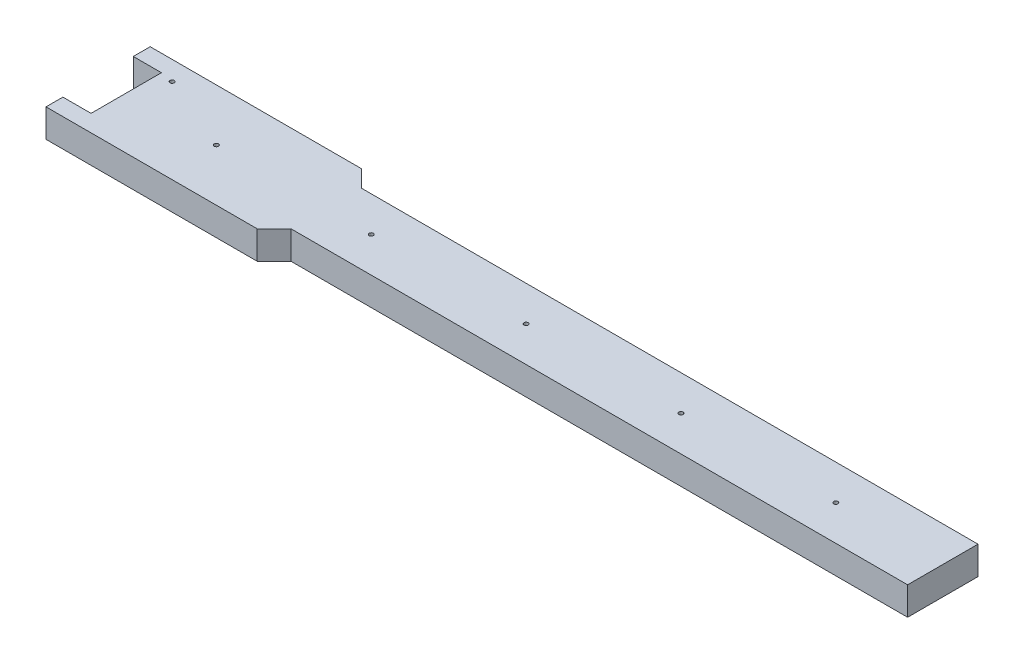
ISO-10303-21;
HEADER;
FILE_DESCRIPTION(('STEP AP214'),'2;1');
FILE_NAME('part.step','',(''),(''),'','','');
FILE_SCHEMA(('AUTOMOTIVE_DESIGN { 1 0 10303 214 1 1 1 1 }'));
ENDSEC;
DATA;
#1=APPLICATION_CONTEXT('core data for automotive mechanical design processes');
#2=APPLICATION_PROTOCOL_DEFINITION('international standard','automotive_design',2000,#1);
#3=PRODUCT_CONTEXT('',#1,'mechanical');
#4=PRODUCT('Part','Part','',(#3));
#5=PRODUCT_RELATED_PRODUCT_CATEGORY('part','',(#4));
#6=PRODUCT_DEFINITION_FORMATION('','',#4);
#7=PRODUCT_DEFINITION_CONTEXT('part definition',#1,'design');
#8=PRODUCT_DEFINITION('design','',#6,#7);
#9=PRODUCT_DEFINITION_SHAPE('','',#8);
#10=(LENGTH_UNIT() NAMED_UNIT(*) SI_UNIT(.MILLI.,.METRE.));
#11=(NAMED_UNIT(*) PLANE_ANGLE_UNIT() SI_UNIT($,.RADIAN.));
#12=(NAMED_UNIT(*) SI_UNIT($,.STERADIAN.) SOLID_ANGLE_UNIT());
#13=UNCERTAINTY_MEASURE_WITH_UNIT(LENGTH_MEASURE(1.E-05),#10,'distance_accuracy_value','');
#14=(GEOMETRIC_REPRESENTATION_CONTEXT(3) GLOBAL_UNCERTAINTY_ASSIGNED_CONTEXT((#13)) GLOBAL_UNIT_ASSIGNED_CONTEXT((#10,
#11,#12)) REPRESENTATION_CONTEXT('',''));
#15=CARTESIAN_POINT('',(0.,0.,0.));
#16=DIRECTION('',(0.,0.,1.));
#17=DIRECTION('',(1.,0.,0.));
#18=AXIS2_PLACEMENT_3D('',#15,#16,#17);
#19=CARTESIAN_POINT('',(0.,10.,-25.));
#20=DIRECTION('',(1.,0.,0.));
#21=DIRECTION('',(0.,0.,-1.));
#22=AXIS2_PLACEMENT_3D('',#19,#20,#21);
#23=PLANE('',#22);
#24=DIRECTION('',(0.,0.,1.));
#25=VECTOR('',#24,1.);
#26=CARTESIAN_POINT('',(0.,0.,-25.));
#27=LINE('',#26,#25);
#28=CARTESIAN_POINT('',(-1.11022302462516E-13,0.,-31.));
#29=VERTEX_POINT('',#28);
#30=CARTESIAN_POINT('',(0.,0.,-25.));
#31=VERTEX_POINT('',#30);
#32=EDGE_CURVE('E158',#29,#31,#27,.T.);
#33=ORIENTED_EDGE('',*,*,#32,.T.);
#34=DIRECTION('',(0.,-1.,0.));
#35=VECTOR('',#34,1.);
#36=CARTESIAN_POINT('',(0.,10.,-25.));
#37=LINE('',#36,#35);
#38=CARTESIAN_POINT('',(0.,10.,-25.));
#39=VERTEX_POINT('',#38);
#40=EDGE_CURVE('E206',#39,#31,#37,.T.);
#41=ORIENTED_EDGE('',*,*,#40,.F.);
#42=DIRECTION('',(0.,0.,1.));
#43=VECTOR('',#42,1.);
#44=CARTESIAN_POINT('',(0.,10.,-25.));
#45=LINE('',#44,#43);
#46=CARTESIAN_POINT('',(-1.11022302462516E-13,10.,-31.));
#47=VERTEX_POINT('',#46);
#48=EDGE_CURVE('E181',#47,#39,#45,.T.);
#49=ORIENTED_EDGE('',*,*,#48,.F.);
#50=DIRECTION('',(0.,-1.,0.));
#51=VECTOR('',#50,1.);
#52=CARTESIAN_POINT('',(-1.11022302462516E-13,10.,-31.));
#53=LINE('',#52,#51);
#54=EDGE_CURVE('E154',#47,#29,#53,.T.);
#55=ORIENTED_EDGE('',*,*,#54,.T.);
#56=EDGE_LOOP('',(#33,#41,#49,#55));
#57=FACE_BOUND('',#56,.T.);
#58=ADVANCED_FACE('F35',(#57),#23,.F.);
#59=CARTESIAN_POINT('',(9.99999999999998,10.,-25.));
#60=DIRECTION('',(0.,0.,-1.));
#61=DIRECTION('',(-1.,0.,0.));
#62=AXIS2_PLACEMENT_3D('',#59,#60,#61);
#63=PLANE('',#62);
#64=DIRECTION('',(1.,0.,0.));
#65=VECTOR('',#64,1.);
#66=CARTESIAN_POINT('',(9.99999999999998,0.,-25.));
#67=LINE('',#66,#65);
#68=CARTESIAN_POINT('',(9.99999999999998,0.,-25.));
#69=VERTEX_POINT('',#68);
#70=EDGE_CURVE('E161',#31,#69,#67,.T.);
#71=ORIENTED_EDGE('',*,*,#70,.T.);
#72=DIRECTION('',(0.,-1.,0.));
#73=VECTOR('',#72,1.);
#74=CARTESIAN_POINT('',(9.99999999999998,10.,-25.));
#75=LINE('',#74,#73);
#76=CARTESIAN_POINT('',(9.99999999999998,10.,-25.));
#77=VERTEX_POINT('',#76);
#78=EDGE_CURVE('E203',#77,#69,#75,.T.);
#79=ORIENTED_EDGE('',*,*,#78,.F.);
#80=DIRECTION('',(1.,0.,0.));
#81=VECTOR('',#80,1.);
#82=CARTESIAN_POINT('',(9.99999999999998,10.,-25.));
#83=LINE('',#82,#81);
#84=EDGE_CURVE('E108',#39,#77,#83,.T.);
#85=ORIENTED_EDGE('',*,*,#84,.F.);
#86=ORIENTED_EDGE('',*,*,#40,.T.);
#87=EDGE_LOOP('',(#71,#79,#85,#86));
#88=FACE_BOUND('',#87,.T.);
#89=ADVANCED_FACE('F247',(#88),#63,.F.);
#90=CARTESIAN_POINT('',(9.99999999999999,10.,0.));
#91=DIRECTION('',(1.,0.,0.));
#92=DIRECTION('',(0.,0.,-1.));
#93=AXIS2_PLACEMENT_3D('',#90,#91,#92);
#94=PLANE('',#93);
#95=DIRECTION('',(0.,0.,1.));
#96=VECTOR('',#95,1.);
#97=CARTESIAN_POINT('',(9.99999999999999,0.,0.));
#98=LINE('',#97,#96);
#99=CARTESIAN_POINT('',(9.99999999999999,0.,0.));
#100=VERTEX_POINT('',#99);
#101=EDGE_CURVE('E164',#69,#100,#98,.T.);
#102=ORIENTED_EDGE('',*,*,#101,.T.);
#103=DIRECTION('',(0.,-1.,0.));
#104=VECTOR('',#103,1.);
#105=CARTESIAN_POINT('',(9.99999999999999,10.,0.));
#106=LINE('',#105,#104);
#107=CARTESIAN_POINT('',(9.99999999999999,10.,0.));
#108=VERTEX_POINT('',#107);
#109=EDGE_CURVE('E200',#108,#100,#106,.T.);
#110=ORIENTED_EDGE('',*,*,#109,.F.);
#111=DIRECTION('',(0.,0.,1.));
#112=VECTOR('',#111,1.);
#113=CARTESIAN_POINT('',(9.99999999999999,10.,0.));
#114=LINE('',#113,#112);
#115=EDGE_CURVE('E339',#77,#108,#114,.T.);
#116=ORIENTED_EDGE('',*,*,#115,.F.);
#117=ORIENTED_EDGE('',*,*,#78,.T.);
#118=EDGE_LOOP('',(#102,#110,#116,#117));
#119=FACE_BOUND('',#118,.T.);
#120=ADVANCED_FACE('F253',(#119),#94,.F.);
#121=CARTESIAN_POINT('',(0.,10.,0.));
#122=DIRECTION('',(0.,0.,1.));
#123=DIRECTION('',(1.,0.,0.));
#124=AXIS2_PLACEMENT_3D('',#121,#122,#123);
#125=PLANE('',#124);
#126=DIRECTION('',(-1.,0.,0.));
#127=VECTOR('',#126,1.);
#128=CARTESIAN_POINT('',(0.,0.,0.));
#129=LINE('',#128,#127);
#130=CARTESIAN_POINT('',(0.,0.,0.));
#131=VERTEX_POINT('',#130);
#132=EDGE_CURVE('E166',#100,#131,#129,.T.);
#133=ORIENTED_EDGE('',*,*,#132,.T.);
#134=DIRECTION('',(0.,-1.,0.));
#135=VECTOR('',#134,1.);
#136=CARTESIAN_POINT('',(0.,10.,0.));
#137=LINE('',#136,#135);
#138=CARTESIAN_POINT('',(0.,10.,0.));
#139=VERTEX_POINT('',#138);
#140=EDGE_CURVE('E197',#139,#131,#137,.T.);
#141=ORIENTED_EDGE('',*,*,#140,.F.);
#142=DIRECTION('',(-1.,0.,0.));
#143=VECTOR('',#142,1.);
#144=CARTESIAN_POINT('',(0.,10.,0.));
#145=LINE('',#144,#143);
#146=EDGE_CURVE('E341',#108,#139,#145,.T.);
#147=ORIENTED_EDGE('',*,*,#146,.F.);
#148=ORIENTED_EDGE('',*,*,#109,.T.);
#149=EDGE_LOOP('',(#133,#141,#147,#148));
#150=FACE_BOUND('',#149,.T.);
#151=ADVANCED_FACE('F373',(#150),#125,.F.);
#152=CARTESIAN_POINT('',(0.,10.,6.00000000000009));
#153=DIRECTION('',(1.,0.,0.));
#154=DIRECTION('',(0.,0.,-1.));
#155=AXIS2_PLACEMENT_3D('',#152,#153,#154);
#156=PLANE('',#155);
#157=DIRECTION('',(0.,0.,1.));
#158=VECTOR('',#157,1.);
#159=CARTESIAN_POINT('',(0.,0.,6.00000000000009));
#160=LINE('',#159,#158);
#161=CARTESIAN_POINT('',(0.,0.,6.00000000000009));
#162=VERTEX_POINT('',#161);
#163=EDGE_CURVE('E168',#131,#162,#160,.T.);
#164=ORIENTED_EDGE('',*,*,#163,.T.);
#165=DIRECTION('',(0.,-1.,0.));
#166=VECTOR('',#165,1.);
#167=CARTESIAN_POINT('',(0.,10.,6.00000000000009));
#168=LINE('',#167,#166);
#169=CARTESIAN_POINT('',(0.,10.,6.00000000000009));
#170=VERTEX_POINT('',#169);
#171=EDGE_CURVE('E194',#170,#162,#168,.T.);
#172=ORIENTED_EDGE('',*,*,#171,.F.);
#173=DIRECTION('',(0.,0.,1.));
#174=VECTOR('',#173,1.);
#175=CARTESIAN_POINT('',(0.,10.,6.00000000000009));
#176=LINE('',#175,#174);
#177=EDGE_CURVE('E343',#139,#170,#176,.T.);
#178=ORIENTED_EDGE('',*,*,#177,.F.);
#179=ORIENTED_EDGE('',*,*,#140,.T.);
#180=EDGE_LOOP('',(#164,#172,#178,#179));
#181=FACE_BOUND('',#180,.T.);
#182=ADVANCED_FACE('F379',(#181),#156,.F.);
#183=CARTESIAN_POINT('',(75.,10.,6.00000000000002));
#184=DIRECTION('',(0.,0.,-1.));
#185=DIRECTION('',(-1.,0.,0.));
#186=AXIS2_PLACEMENT_3D('',#183,#184,#185);
#187=PLANE('',#186);
#188=DIRECTION('',(1.,0.,0.));
#189=VECTOR('',#188,1.);
#190=CARTESIAN_POINT('',(75.,0.,6.00000000000002));
#191=LINE('',#190,#189);
#192=CARTESIAN_POINT('',(75.,0.,6.00000000000002));
#193=VERTEX_POINT('',#192);
#194=EDGE_CURVE('E170',#162,#193,#191,.T.);
#195=ORIENTED_EDGE('',*,*,#194,.T.);
#196=DIRECTION('',(0.,-1.,0.));
#197=VECTOR('',#196,1.);
#198=CARTESIAN_POINT('',(75.,10.,6.00000000000002));
#199=LINE('',#198,#197);
#200=CARTESIAN_POINT('',(75.,10.,6.00000000000002));
#201=VERTEX_POINT('',#200);
#202=EDGE_CURVE('E191',#201,#193,#199,.T.);
#203=ORIENTED_EDGE('',*,*,#202,.F.);
#204=DIRECTION('',(1.,0.,0.));
#205=VECTOR('',#204,1.);
#206=CARTESIAN_POINT('',(75.,10.,6.00000000000002));
#207=LINE('',#206,#205);
#208=EDGE_CURVE('E345',#170,#201,#207,.T.);
#209=ORIENTED_EDGE('',*,*,#208,.F.);
#210=ORIENTED_EDGE('',*,*,#171,.T.);
#211=EDGE_LOOP('',(#195,#203,#209,#210));
#212=FACE_BOUND('',#211,.T.);
#213=ADVANCED_FACE('F383',(#212),#187,.F.);
#214=CARTESIAN_POINT('',(80.9999999999998,10.,0.));
#215=DIRECTION('',(-0.707106781186556,0.,-0.70710678118654));
#216=DIRECTION('',(-0.70710678118654,0.,0.707106781186556));
#217=AXIS2_PLACEMENT_3D('',#214,#215,#216);
#218=PLANE('',#217);
#219=DIRECTION('',(0.70710678118654,0.,-0.707106781186556));
#220=VECTOR('',#219,1.);
#221=CARTESIAN_POINT('',(80.9999999999998,0.,0.));
#222=LINE('',#221,#220);
#223=CARTESIAN_POINT('',(80.9999999999998,0.,0.));
#224=VERTEX_POINT('',#223);
#225=EDGE_CURVE('E172',#193,#224,#222,.T.);
#226=ORIENTED_EDGE('',*,*,#225,.T.);
#227=DIRECTION('',(0.,-1.,0.));
#228=VECTOR('',#227,1.);
#229=CARTESIAN_POINT('',(80.9999999999998,10.,0.));
#230=LINE('',#229,#228);
#231=CARTESIAN_POINT('',(80.9999999999998,10.,0.));
#232=VERTEX_POINT('',#231);
#233=EDGE_CURVE('E188',#232,#224,#230,.T.);
#234=ORIENTED_EDGE('',*,*,#233,.F.);
#235=DIRECTION('',(0.70710678118654,0.,-0.707106781186556));
#236=VECTOR('',#235,1.);
#237=CARTESIAN_POINT('',(80.9999999999998,10.,0.));
#238=LINE('',#237,#236);
#239=EDGE_CURVE('E347',#201,#232,#238,.T.);
#240=ORIENTED_EDGE('',*,*,#239,.F.);
#241=ORIENTED_EDGE('',*,*,#202,.T.);
#242=EDGE_LOOP('',(#226,#234,#240,#241));
#243=FACE_BOUND('',#242,.T.);
#244=ADVANCED_FACE('F386',(#243),#218,.F.);
#245=CARTESIAN_POINT('',(300.,10.,0.));
#246=DIRECTION('',(0.,0.,-1.));
#247=DIRECTION('',(-1.,0.,0.));
#248=AXIS2_PLACEMENT_3D('',#245,#246,#247);
#249=PLANE('',#248);
#250=DIRECTION('',(1.,0.,0.));
#251=VECTOR('',#250,1.);
#252=CARTESIAN_POINT('',(300.,0.,0.));
#253=LINE('',#252,#251);
#254=CARTESIAN_POINT('',(300.,0.,0.));
#255=VERTEX_POINT('',#254);
#256=EDGE_CURVE('E174',#224,#255,#253,.T.);
#257=ORIENTED_EDGE('',*,*,#256,.T.);
#258=DIRECTION('',(0.,-1.,0.));
#259=VECTOR('',#258,1.);
#260=CARTESIAN_POINT('',(300.,10.,0.));
#261=LINE('',#260,#259);
#262=CARTESIAN_POINT('',(300.,10.,0.));
#263=VERTEX_POINT('',#262);
#264=EDGE_CURVE('E185',#263,#255,#261,.T.);
#265=ORIENTED_EDGE('',*,*,#264,.F.);
#266=DIRECTION('',(1.,0.,0.));
#267=VECTOR('',#266,1.);
#268=CARTESIAN_POINT('',(300.,10.,0.));
#269=LINE('',#268,#267);
#270=EDGE_CURVE('E349',#232,#263,#269,.T.);
#271=ORIENTED_EDGE('',*,*,#270,.F.);
#272=ORIENTED_EDGE('',*,*,#233,.T.);
#273=EDGE_LOOP('',(#257,#265,#271,#272));
#274=FACE_BOUND('',#273,.T.);
#275=ADVANCED_FACE('F355',(#274),#249,.F.);
#276=CARTESIAN_POINT('',(300.,10.,-25.0000000000001));
#277=DIRECTION('',(-1.,0.,0.));
#278=DIRECTION('',(0.,0.,1.));
#279=AXIS2_PLACEMENT_3D('',#276,#277,#278);
#280=PLANE('',#279);
#281=DIRECTION('',(0.,0.,-1.));
#282=VECTOR('',#281,1.);
#283=CARTESIAN_POINT('',(300.,0.,-25.0000000000001));
#284=LINE('',#283,#282);
#285=CARTESIAN_POINT('',(300.,0.,-25.0000000000001));
#286=VERTEX_POINT('',#285);
#287=EDGE_CURVE('E176',#255,#286,#284,.T.);
#288=ORIENTED_EDGE('',*,*,#287,.T.);
#289=DIRECTION('',(0.,-1.,0.));
#290=VECTOR('',#289,1.);
#291=CARTESIAN_POINT('',(300.,10.,-25.0000000000001));
#292=LINE('',#291,#290);
#293=CARTESIAN_POINT('',(300.,10.,-25.0000000000001));
#294=VERTEX_POINT('',#293);
#295=EDGE_CURVE('E149',#294,#286,#292,.T.);
#296=ORIENTED_EDGE('',*,*,#295,.F.);
#297=DIRECTION('',(0.,0.,-1.));
#298=VECTOR('',#297,1.);
#299=CARTESIAN_POINT('',(300.,10.,-25.0000000000001));
#300=LINE('',#299,#298);
#301=EDGE_CURVE('E140',#263,#294,#300,.T.);
#302=ORIENTED_EDGE('',*,*,#301,.F.);
#303=ORIENTED_EDGE('',*,*,#264,.T.);
#304=EDGE_LOOP('',(#288,#296,#302,#303));
#305=FACE_BOUND('',#304,.T.);
#306=ADVANCED_FACE('F359',(#305),#280,.F.);
#307=CARTESIAN_POINT('',(80.9999999999999,10.,-25.0000000000001));
#308=DIRECTION('',(0.,0.,1.));
#309=DIRECTION('',(1.,0.,0.));
#310=AXIS2_PLACEMENT_3D('',#307,#308,#309);
#311=PLANE('',#310);
#312=DIRECTION('',(-1.,0.,0.));
#313=VECTOR('',#312,1.);
#314=CARTESIAN_POINT('',(80.9999999999999,0.,-25.0000000000001));
#315=LINE('',#314,#313);
#316=CARTESIAN_POINT('',(80.9999999999999,0.,-25.0000000000001));
#317=VERTEX_POINT('',#316);
#318=EDGE_CURVE('E148',#286,#317,#315,.T.);
#319=ORIENTED_EDGE('',*,*,#318,.T.);
#320=DIRECTION('',(0.,-1.,0.));
#321=VECTOR('',#320,1.);
#322=CARTESIAN_POINT('',(80.9999999999999,10.,-25.0000000000001));
#323=LINE('',#322,#321);
#324=CARTESIAN_POINT('',(80.9999999999999,10.,-25.0000000000001));
#325=VERTEX_POINT('',#324);
#326=EDGE_CURVE('E145',#325,#317,#323,.T.);
#327=ORIENTED_EDGE('',*,*,#326,.F.);
#328=DIRECTION('',(-1.,0.,0.));
#329=VECTOR('',#328,1.);
#330=CARTESIAN_POINT('',(80.9999999999999,10.,-25.0000000000001));
#331=LINE('',#330,#329);
#332=EDGE_CURVE('E133',#294,#325,#331,.T.);
#333=ORIENTED_EDGE('',*,*,#332,.F.);
#334=ORIENTED_EDGE('',*,*,#295,.T.);
#335=EDGE_LOOP('',(#319,#327,#333,#334));
#336=FACE_BOUND('',#335,.T.);
#337=ADVANCED_FACE('F146',(#336),#311,.F.);
#338=CARTESIAN_POINT('',(74.9999999999999,10.,-30.9999999999999));
#339=DIRECTION('',(-0.707106781186541,0.,0.707106781186554));
#340=DIRECTION('',(0.707106781186554,0.,0.707106781186541));
#341=AXIS2_PLACEMENT_3D('',#338,#339,#340);
#342=PLANE('',#341);
#343=DIRECTION('',(-0.707106781186554,0.,-0.707106781186541));
#344=VECTOR('',#343,1.);
#345=CARTESIAN_POINT('',(74.9999999999999,0.,-30.9999999999999));
#346=LINE('',#345,#344);
#347=CARTESIAN_POINT('',(74.9999999999999,0.,-30.9999999999999));
#348=VERTEX_POINT('',#347);
#349=EDGE_CURVE('E93',#317,#348,#346,.T.);
#350=ORIENTED_EDGE('',*,*,#349,.T.);
#351=DIRECTION('',(0.,-1.,0.));
#352=VECTOR('',#351,1.);
#353=CARTESIAN_POINT('',(74.9999999999999,10.,-30.9999999999999));
#354=LINE('',#353,#352);
#355=CARTESIAN_POINT('',(74.9999999999999,10.,-30.9999999999999));
#356=VERTEX_POINT('',#355);
#357=EDGE_CURVE('E150',#356,#348,#354,.T.);
#358=ORIENTED_EDGE('',*,*,#357,.F.);
#359=DIRECTION('',(-0.707106781186554,0.,-0.707106781186541));
#360=VECTOR('',#359,1.);
#361=CARTESIAN_POINT('',(74.9999999999999,10.,-30.9999999999999));
#362=LINE('',#361,#360);
#363=EDGE_CURVE('E138',#325,#356,#362,.T.);
#364=ORIENTED_EDGE('',*,*,#363,.F.);
#365=ORIENTED_EDGE('',*,*,#326,.T.);
#366=EDGE_LOOP('',(#350,#358,#364,#365));
#367=FACE_BOUND('',#366,.T.);
#368=ADVANCED_FACE('F152',(#367),#342,.F.);
#369=CARTESIAN_POINT('',(-1.11022302462516E-13,10.,-31.));
#370=DIRECTION('',(0.,0.,1.));
#371=DIRECTION('',(1.,0.,0.));
#372=AXIS2_PLACEMENT_3D('',#369,#370,#371);
#373=PLANE('',#372);
#374=DIRECTION('',(-1.,0.,0.));
#375=VECTOR('',#374,1.);
#376=CARTESIAN_POINT('',(-1.11022302462516E-13,0.,-31.));
#377=LINE('',#376,#375);
#378=EDGE_CURVE('E99',#348,#29,#377,.T.);
#379=ORIENTED_EDGE('',*,*,#378,.T.);
#380=ORIENTED_EDGE('',*,*,#54,.F.);
#381=DIRECTION('',(-1.,0.,0.));
#382=VECTOR('',#381,1.);
#383=CARTESIAN_POINT('',(-1.11022302462516E-13,10.,-31.));
#384=LINE('',#383,#382);
#385=EDGE_CURVE('E52',#356,#47,#384,.T.);
#386=ORIENTED_EDGE('',*,*,#385,.F.);
#387=ORIENTED_EDGE('',*,*,#357,.T.);
#388=EDGE_LOOP('',(#379,#380,#386,#387));
#389=FACE_BOUND('',#388,.T.);
#390=ADVANCED_FACE('F231',(#389),#373,.F.);
#391=CARTESIAN_POINT('',(0.,10.,0.));
#392=DIRECTION('',(0.,-1.,0.));
#393=DIRECTION('',(0.,0.,-1.));
#394=AXIS2_PLACEMENT_3D('',#391,#392,#393);
#395=PLANE('',#394);
#396=CARTESIAN_POINT('',(14.6333338863244,10.,-24.1360001056365));
#397=DIRECTION('',(0.,-1.,0.));
#398=DIRECTION('',(0.,0.,-1.));
#399=AXIS2_PLACEMENT_3D('',#396,#397,#398);
#400=CIRCLE('',#399,0.749999999999999);
#401=CARTESIAN_POINT('',(14.6333338863244,10.,-24.8860001056365));
#402=VERTEX_POINT('',#401);
#403=EDGE_CURVE('E331',#402,#402,#400,.T.);
#404=ORIENTED_EDGE('',*,*,#403,.T.);
#405=EDGE_LOOP('',(#404));
#406=FACE_BOUND('',#405,.T.);
#407=CARTESIAN_POINT('',(96.9999999999999,10.,-12.4999999999999));
#408=DIRECTION('',(0.,1.,0.));
#409=DIRECTION('',(0.,0.,1.));
#410=AXIS2_PLACEMENT_3D('',#407,#408,#409);
#411=CIRCLE('',#410,0.749999999999999);
#412=CARTESIAN_POINT('',(96.9999999999999,10.,-11.7499999999999));
#413=VERTEX_POINT('',#412);
#414=EDGE_CURVE('E326',#413,#413,#411,.T.);
#415=ORIENTED_EDGE('',*,*,#414,.F.);
#416=EDGE_LOOP('',(#415));
#417=FACE_BOUND('',#416,.T.);
#418=CARTESIAN_POINT('',(41.9999999999999,10.,-12.4999999999999));
#419=DIRECTION('',(0.,1.,0.));
#420=DIRECTION('',(0.,0.,1.));
#421=AXIS2_PLACEMENT_3D('',#418,#419,#420);
#422=CIRCLE('',#421,0.749999999999999);
#423=CARTESIAN_POINT('',(41.9999999999999,10.,-11.75));
#424=VERTEX_POINT('',#423);
#425=EDGE_CURVE('E327',#424,#424,#422,.T.);
#426=ORIENTED_EDGE('',*,*,#425,.F.);
#427=EDGE_LOOP('',(#426));
#428=FACE_BOUND('',#427,.T.);
#429=ORIENTED_EDGE('',*,*,#48,.T.);
#430=ORIENTED_EDGE('',*,*,#84,.T.);
#431=ORIENTED_EDGE('',*,*,#115,.T.);
#432=ORIENTED_EDGE('',*,*,#146,.T.);
#433=ORIENTED_EDGE('',*,*,#177,.T.);
#434=ORIENTED_EDGE('',*,*,#208,.T.);
#435=ORIENTED_EDGE('',*,*,#239,.T.);
#436=ORIENTED_EDGE('',*,*,#270,.T.);
#437=ORIENTED_EDGE('',*,*,#301,.T.);
#438=ORIENTED_EDGE('',*,*,#332,.T.);
#439=ORIENTED_EDGE('',*,*,#363,.T.);
#440=ORIENTED_EDGE('',*,*,#385,.T.);
#441=EDGE_LOOP('',(#429,#430,#431,#432,#433,#434,#435,#436,#437,#438,#439,#440));
#442=FACE_BOUND('',#441,.T.);
#443=CARTESIAN_POINT('',(152.,10.,-12.4999999999999));
#444=DIRECTION('',(0.,1.,0.));
#445=DIRECTION('',(0.,0.,1.));
#446=AXIS2_PLACEMENT_3D('',#443,#444,#445);
#447=CIRCLE('',#446,0.749999999999999);
#448=CARTESIAN_POINT('',(152.,10.,-11.7499999999999));
#449=VERTEX_POINT('',#448);
#450=EDGE_CURVE('E211',#449,#449,#447,.T.);
#451=ORIENTED_EDGE('',*,*,#450,.F.);
#452=EDGE_LOOP('',(#451));
#453=FACE_BOUND('',#452,.T.);
#454=CARTESIAN_POINT('',(207.,10.,-12.4999999999999));
#455=DIRECTION('',(0.,1.,0.));
#456=DIRECTION('',(0.,0.,1.));
#457=AXIS2_PLACEMENT_3D('',#454,#455,#456);
#458=CIRCLE('',#457,0.749999999999999);
#459=CARTESIAN_POINT('',(207.,10.,-11.7499999999999));
#460=VERTEX_POINT('',#459);
#461=EDGE_CURVE('E217',#460,#460,#458,.T.);
#462=ORIENTED_EDGE('',*,*,#461,.F.);
#463=EDGE_LOOP('',(#462));
#464=FACE_BOUND('',#463,.T.);
#465=CARTESIAN_POINT('',(262.,10.,-12.4999999999999));
#466=DIRECTION('',(0.,1.,0.));
#467=DIRECTION('',(0.,0.,1.));
#468=AXIS2_PLACEMENT_3D('',#465,#466,#467);
#469=CIRCLE('',#468,0.749999999999999);
#470=CARTESIAN_POINT('',(262.,10.,-11.7499999999999));
#471=VERTEX_POINT('',#470);
#472=EDGE_CURVE('E11',#471,#471,#469,.T.);
#473=ORIENTED_EDGE('',*,*,#472,.F.);
#474=EDGE_LOOP('',(#473));
#475=FACE_BOUND('',#474,.T.);
#476=ADVANCED_FACE('F135',(#406,#417,#428,#442,#453,#464,#475),#395,.F.);
#477=CARTESIAN_POINT('',(0.,0.,0.));
#478=DIRECTION('',(0.,-1.,0.));
#479=DIRECTION('',(0.,0.,-1.));
#480=AXIS2_PLACEMENT_3D('',#477,#478,#479);
#481=PLANE('',#480);
#482=CARTESIAN_POINT('',(14.6333338863244,0.,-24.1360001056365));
#483=DIRECTION('',(0.,-1.,0.));
#484=DIRECTION('',(0.,0.,-1.));
#485=AXIS2_PLACEMENT_3D('',#482,#483,#484);
#486=CIRCLE('',#485,0.749999999999999);
#487=CARTESIAN_POINT('',(14.6333338863244,0.,-24.8860001056365));
#488=VERTEX_POINT('',#487);
#489=EDGE_CURVE('E484',#488,#488,#486,.T.);
#490=ORIENTED_EDGE('',*,*,#489,.F.);
#491=EDGE_LOOP('',(#490));
#492=FACE_BOUND('',#491,.T.);
#493=CARTESIAN_POINT('',(96.9999999999999,0.,-12.4999999999999));
#494=DIRECTION('',(0.,1.,0.));
#495=DIRECTION('',(0.,0.,1.));
#496=AXIS2_PLACEMENT_3D('',#493,#494,#495);
#497=CIRCLE('',#496,0.749999999999999);
#498=CARTESIAN_POINT('',(96.9999999999999,0.,-11.7499999999999));
#499=VERTEX_POINT('',#498);
#500=EDGE_CURVE('E323',#499,#499,#497,.T.);
#501=ORIENTED_EDGE('',*,*,#500,.T.);
#502=EDGE_LOOP('',(#501));
#503=FACE_BOUND('',#502,.T.);
#504=CARTESIAN_POINT('',(41.9999999999999,0.,-12.4999999999999));
#505=DIRECTION('',(0.,1.,0.));
#506=DIRECTION('',(0.,0.,1.));
#507=AXIS2_PLACEMENT_3D('',#504,#505,#506);
#508=CIRCLE('',#507,0.749999999999999);
#509=CARTESIAN_POINT('',(41.9999999999999,0.,-11.75));
#510=VERTEX_POINT('',#509);
#511=EDGE_CURVE('E162',#510,#510,#508,.T.);
#512=ORIENTED_EDGE('',*,*,#511,.T.);
#513=EDGE_LOOP('',(#512));
#514=FACE_BOUND('',#513,.T.);
#515=ORIENTED_EDGE('',*,*,#32,.F.);
#516=ORIENTED_EDGE('',*,*,#378,.F.);
#517=ORIENTED_EDGE('',*,*,#349,.F.);
#518=ORIENTED_EDGE('',*,*,#318,.F.);
#519=ORIENTED_EDGE('',*,*,#287,.F.);
#520=ORIENTED_EDGE('',*,*,#256,.F.);
#521=ORIENTED_EDGE('',*,*,#225,.F.);
#522=ORIENTED_EDGE('',*,*,#194,.F.);
#523=ORIENTED_EDGE('',*,*,#163,.F.);
#524=ORIENTED_EDGE('',*,*,#132,.F.);
#525=ORIENTED_EDGE('',*,*,#101,.F.);
#526=ORIENTED_EDGE('',*,*,#70,.F.);
#527=EDGE_LOOP('',(#515,#516,#517,#518,#519,#520,#521,#522,#523,#524,#525,#526));
#528=FACE_BOUND('',#527,.T.);
#529=CARTESIAN_POINT('',(152.,0.,-12.4999999999999));
#530=DIRECTION('',(0.,1.,0.));
#531=DIRECTION('',(0.,0.,1.));
#532=AXIS2_PLACEMENT_3D('',#529,#530,#531);
#533=CIRCLE('',#532,0.749999999999999);
#534=CARTESIAN_POINT('',(152.,0.,-11.7499999999999));
#535=VERTEX_POINT('',#534);
#536=EDGE_CURVE('E208',#535,#535,#533,.T.);
#537=ORIENTED_EDGE('',*,*,#536,.T.);
#538=EDGE_LOOP('',(#537));
#539=FACE_BOUND('',#538,.T.);
#540=CARTESIAN_POINT('',(207.,0.,-12.4999999999999));
#541=DIRECTION('',(0.,1.,0.));
#542=DIRECTION('',(0.,0.,1.));
#543=AXIS2_PLACEMENT_3D('',#540,#541,#542);
#544=CIRCLE('',#543,0.749999999999999);
#545=CARTESIAN_POINT('',(207.,0.,-11.7499999999999));
#546=VERTEX_POINT('',#545);
#547=EDGE_CURVE('E214',#546,#546,#544,.T.);
#548=ORIENTED_EDGE('',*,*,#547,.T.);
#549=EDGE_LOOP('',(#548));
#550=FACE_BOUND('',#549,.T.);
#551=CARTESIAN_POINT('',(262.,0.,-12.4999999999999));
#552=DIRECTION('',(0.,1.,0.));
#553=DIRECTION('',(0.,0.,1.));
#554=AXIS2_PLACEMENT_3D('',#551,#552,#553);
#555=CIRCLE('',#554,0.749999999999999);
#556=CARTESIAN_POINT('',(262.,0.,-11.7499999999999));
#557=VERTEX_POINT('',#556);
#558=EDGE_CURVE('E44',#557,#557,#555,.T.);
#559=ORIENTED_EDGE('',*,*,#558,.T.);
#560=EDGE_LOOP('',(#559));
#561=FACE_BOUND('',#560,.T.);
#562=ADVANCED_FACE('F222',(#492,#503,#514,#528,#539,#550,#561),#481,.T.);
#563=CARTESIAN_POINT('',(41.9999999999999,0.,-12.4999999999999));
#564=DIRECTION('',(0.,1.,0.));
#565=DIRECTION('',(0.,0.,1.));
#566=AXIS2_PLACEMENT_3D('',#563,#564,#565);
#567=CYLINDRICAL_SURFACE('',#566,0.749999999999999);
#568=ORIENTED_EDGE('',*,*,#511,.F.);
#569=EDGE_LOOP('',(#568));
#570=FACE_BOUND('',#569,.T.);
#571=ORIENTED_EDGE('',*,*,#425,.T.);
#572=EDGE_LOOP('',(#571));
#573=FACE_BOUND('',#572,.T.);
#574=ADVANCED_FACE('F238',(#570,#573),#567,.F.);
#575=CARTESIAN_POINT('',(96.9999999999999,0.,-12.4999999999999));
#576=DIRECTION('',(0.,1.,0.));
#577=DIRECTION('',(0.,0.,1.));
#578=AXIS2_PLACEMENT_3D('',#575,#576,#577);
#579=CYLINDRICAL_SURFACE('',#578,0.749999999999999);
#580=ORIENTED_EDGE('',*,*,#500,.F.);
#581=EDGE_LOOP('',(#580));
#582=FACE_BOUND('',#581,.T.);
#583=ORIENTED_EDGE('',*,*,#414,.T.);
#584=EDGE_LOOP('',(#583));
#585=FACE_BOUND('',#584,.T.);
#586=ADVANCED_FACE('F259',(#582,#585),#579,.F.);
#587=CARTESIAN_POINT('',(152.,0.,-12.4999999999999));
#588=DIRECTION('',(0.,1.,0.));
#589=DIRECTION('',(0.,0.,1.));
#590=AXIS2_PLACEMENT_3D('',#587,#588,#589);
#591=CYLINDRICAL_SURFACE('',#590,0.749999999999999);
#592=ORIENTED_EDGE('',*,*,#536,.F.);
#593=EDGE_LOOP('',(#592));
#594=FACE_BOUND('',#593,.T.);
#595=ORIENTED_EDGE('',*,*,#450,.T.);
#596=EDGE_LOOP('',(#595));
#597=FACE_BOUND('',#596,.T.);
#598=ADVANCED_FACE('F257',(#594,#597),#591,.F.);
#599=CARTESIAN_POINT('',(207.,0.,-12.4999999999999));
#600=DIRECTION('',(0.,1.,0.));
#601=DIRECTION('',(0.,0.,1.));
#602=AXIS2_PLACEMENT_3D('',#599,#600,#601);
#603=CYLINDRICAL_SURFACE('',#602,0.749999999999999);
#604=ORIENTED_EDGE('',*,*,#547,.F.);
#605=EDGE_LOOP('',(#604));
#606=FACE_BOUND('',#605,.T.);
#607=ORIENTED_EDGE('',*,*,#461,.T.);
#608=EDGE_LOOP('',(#607));
#609=FACE_BOUND('',#608,.T.);
#610=ADVANCED_FACE('F227',(#606,#609),#603,.F.);
#611=CARTESIAN_POINT('',(262.,0.,-12.4999999999999));
#612=DIRECTION('',(0.,1.,0.));
#613=DIRECTION('',(0.,0.,1.));
#614=AXIS2_PLACEMENT_3D('',#611,#612,#613);
#615=CYLINDRICAL_SURFACE('',#614,0.749999999999999);
#616=ORIENTED_EDGE('',*,*,#558,.F.);
#617=EDGE_LOOP('',(#616));
#618=FACE_BOUND('',#617,.T.);
#619=ORIENTED_EDGE('',*,*,#472,.T.);
#620=EDGE_LOOP('',(#619));
#621=FACE_BOUND('',#620,.T.);
#622=ADVANCED_FACE('F37',(#618,#621),#615,.F.);
#623=CARTESIAN_POINT('',(14.6333338863244,40.,-24.1360001056365));
#624=DIRECTION('',(0.,-1.,0.));
#625=DIRECTION('',(0.,0.,-1.));
#626=AXIS2_PLACEMENT_3D('',#623,#624,#625);
#627=CYLINDRICAL_SURFACE('',#626,0.749999999999999);
#628=ORIENTED_EDGE('',*,*,#489,.T.);
#629=EDGE_LOOP('',(#628));
#630=FACE_BOUND('',#629,.T.);
#631=ORIENTED_EDGE('',*,*,#403,.F.);
#632=EDGE_LOOP('',(#631));
#633=FACE_BOUND('',#632,.T.);
#634=ADVANCED_FACE('F226',(#630,#633),#627,.F.);
#635=CLOSED_SHELL('',(#58,#89,#120,#151,#182,#213,#244,#275,#306,#337,#368,#390,#476,#562,#574,
#586,#598,#610,#622,#634));
#636=MANIFOLD_SOLID_BREP('B2',#635);
#637=ADVANCED_BREP_SHAPE_REPRESENTATION('',(#18,#636),#14);
#638=SHAPE_DEFINITION_REPRESENTATION(#9,#637);
ENDSEC;
END-ISO-10303-21;
